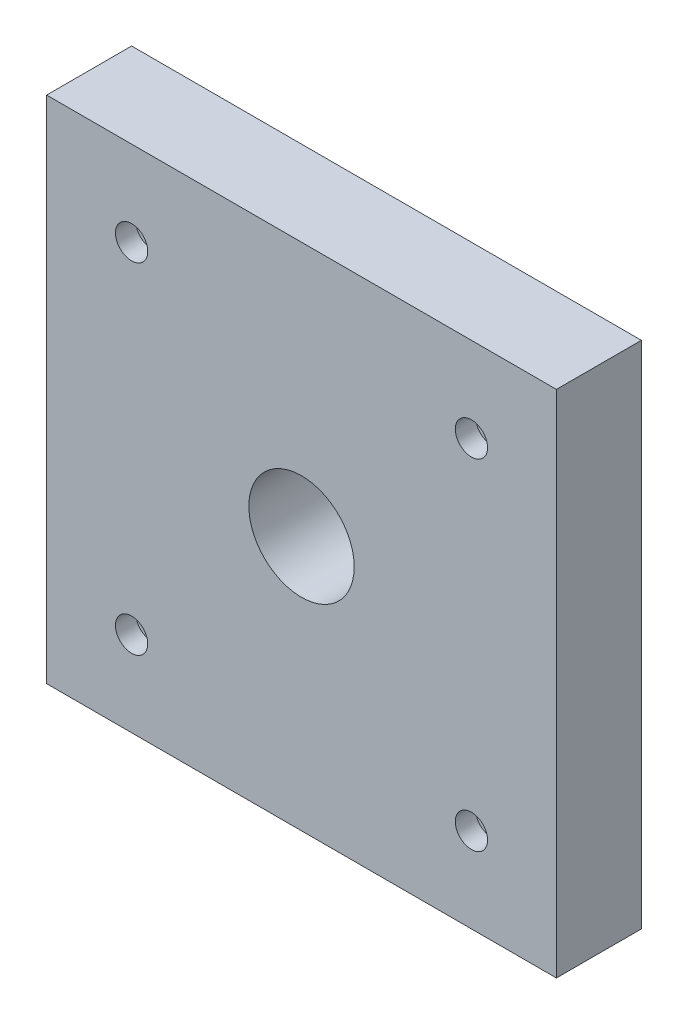
ISO-10303-21;
HEADER;
FILE_DESCRIPTION(('STEP AP214'),'2;1');
FILE_NAME('part.step','',(''),(''),'','','');
FILE_SCHEMA(('AUTOMOTIVE_DESIGN { 1 0 10303 214 1 1 1 1 }'));
ENDSEC;
DATA;
#1=APPLICATION_CONTEXT('core data for automotive mechanical design processes');
#2=APPLICATION_PROTOCOL_DEFINITION('international standard','automotive_design',2000,#1);
#3=PRODUCT_CONTEXT('',#1,'mechanical');
#4=PRODUCT('Part','Part','',(#3));
#5=PRODUCT_RELATED_PRODUCT_CATEGORY('part','',(#4));
#6=PRODUCT_DEFINITION_FORMATION('','',#4);
#7=PRODUCT_DEFINITION_CONTEXT('part definition',#1,'design');
#8=PRODUCT_DEFINITION('design','',#6,#7);
#9=PRODUCT_DEFINITION_SHAPE('','',#8);
#10=(LENGTH_UNIT() NAMED_UNIT(*) SI_UNIT(.MILLI.,.METRE.));
#11=(NAMED_UNIT(*) PLANE_ANGLE_UNIT() SI_UNIT($,.RADIAN.));
#12=(NAMED_UNIT(*) SI_UNIT($,.STERADIAN.) SOLID_ANGLE_UNIT());
#13=UNCERTAINTY_MEASURE_WITH_UNIT(LENGTH_MEASURE(1.E-05),#10,'distance_accuracy_value','');
#14=(GEOMETRIC_REPRESENTATION_CONTEXT(3) GLOBAL_UNCERTAINTY_ASSIGNED_CONTEXT((#13)) GLOBAL_UNIT_ASSIGNED_CONTEXT((#10,
#11,#12)) REPRESENTATION_CONTEXT('',''));
#15=CARTESIAN_POINT('',(0.,0.,0.));
#16=DIRECTION('',(0.,0.,1.));
#17=DIRECTION('',(1.,0.,0.));
#18=AXIS2_PLACEMENT_3D('',#15,#16,#17);
#19=CARTESIAN_POINT('',(0.,0.,12.7));
#20=DIRECTION('',(0.,0.,-1.));
#21=DIRECTION('',(-1.,0.,0.));
#22=AXIS2_PLACEMENT_3D('',#19,#20,#21);
#23=PLANE('',#22);
#24=CARTESIAN_POINT('',(-25.3999999999986,-25.4,12.7));
#25=DIRECTION('',(0.,0.,1.));
#26=DIRECTION('',(1.,0.,0.));
#27=AXIS2_PLACEMENT_3D('',#24,#25,#26);
#28=CIRCLE('',#27,2.41300000000073);
#29=CARTESIAN_POINT('',(-22.9869999999979,-25.4,12.7));
#30=VERTEX_POINT('',#29);
#31=EDGE_CURVE('E124',#30,#30,#28,.T.);
#32=ORIENTED_EDGE('',*,*,#31,.F.);
#33=EDGE_LOOP('',(#32));
#34=FACE_BOUND('',#33,.T.);
#35=CARTESIAN_POINT('',(25.4000000000014,-25.3999999999986,12.7));
#36=DIRECTION('',(0.,0.,1.));
#37=DIRECTION('',(1.,0.,0.));
#38=AXIS2_PLACEMENT_3D('',#35,#36,#37);
#39=CIRCLE('',#38,2.41300000000198);
#40=CARTESIAN_POINT('',(27.8130000000034,-25.3999999999986,12.7));
#41=VERTEX_POINT('',#40);
#42=EDGE_CURVE('E131',#41,#41,#39,.T.);
#43=ORIENTED_EDGE('',*,*,#42,.F.);
#44=EDGE_LOOP('',(#43));
#45=FACE_BOUND('',#44,.T.);
#46=CARTESIAN_POINT('',(25.4,25.4000000000014,12.7));
#47=DIRECTION('',(0.,0.,1.));
#48=DIRECTION('',(1.,0.,0.));
#49=AXIS2_PLACEMENT_3D('',#46,#47,#48);
#50=CIRCLE('',#49,2.41300000000147);
#51=CARTESIAN_POINT('',(27.8130000000014,25.4000000000014,12.7));
#52=VERTEX_POINT('',#51);
#53=EDGE_CURVE('E137',#52,#52,#50,.T.);
#54=ORIENTED_EDGE('',*,*,#53,.F.);
#55=EDGE_LOOP('',(#54));
#56=FACE_BOUND('',#55,.T.);
#57=CARTESIAN_POINT('',(-25.4,25.4,12.7));
#58=DIRECTION('',(0.,0.,1.));
#59=DIRECTION('',(1.,0.,0.));
#60=AXIS2_PLACEMENT_3D('',#57,#58,#59);
#61=CIRCLE('',#60,2.413);
#62=CARTESIAN_POINT('',(-22.987,25.4,12.7));
#63=VERTEX_POINT('',#62);
#64=EDGE_CURVE('E118',#63,#63,#61,.T.);
#65=ORIENTED_EDGE('',*,*,#64,.F.);
#66=EDGE_LOOP('',(#65));
#67=FACE_BOUND('',#66,.T.);
#68=DIRECTION('',(0.,1.,0.));
#69=VECTOR('',#68,1.);
#70=CARTESIAN_POINT('',(38.1,-38.1,12.7));
#71=LINE('',#70,#69);
#72=CARTESIAN_POINT('',(38.1,-38.1,12.7));
#73=VERTEX_POINT('',#72);
#74=CARTESIAN_POINT('',(38.1,38.1,12.7));
#75=VERTEX_POINT('',#74);
#76=EDGE_CURVE('E85',#73,#75,#71,.T.);
#77=ORIENTED_EDGE('',*,*,#76,.T.);
#78=DIRECTION('',(-1.,0.,0.));
#79=VECTOR('',#78,1.);
#80=CARTESIAN_POINT('',(-38.1,38.1,12.7));
#81=LINE('',#80,#79);
#82=CARTESIAN_POINT('',(-38.1,38.1,12.7));
#83=VERTEX_POINT('',#82);
#84=EDGE_CURVE('E80',#75,#83,#81,.T.);
#85=ORIENTED_EDGE('',*,*,#84,.T.);
#86=DIRECTION('',(0.,-1.,0.));
#87=VECTOR('',#86,1.);
#88=CARTESIAN_POINT('',(-38.1,-38.1,12.7));
#89=LINE('',#88,#87);
#90=CARTESIAN_POINT('',(-38.1,-38.1,12.7));
#91=VERTEX_POINT('',#90);
#92=EDGE_CURVE('E83',#83,#91,#89,.T.);
#93=ORIENTED_EDGE('',*,*,#92,.T.);
#94=DIRECTION('',(1.,0.,0.));
#95=VECTOR('',#94,1.);
#96=CARTESIAN_POINT('',(-38.1,-38.1,12.7));
#97=LINE('',#96,#95);
#98=EDGE_CURVE('E50',#91,#73,#97,.T.);
#99=ORIENTED_EDGE('',*,*,#98,.T.);
#100=EDGE_LOOP('',(#77,#85,#93,#99));
#101=FACE_BOUND('',#100,.T.);
#102=CARTESIAN_POINT('',(0.,0.,12.7));
#103=DIRECTION('',(0.,0.,1.));
#104=DIRECTION('',(1.,0.,0.));
#105=AXIS2_PLACEMENT_3D('',#102,#103,#104);
#106=CIRCLE('',#105,7.874);
#107=CARTESIAN_POINT('',(7.87399999999999,0.,12.7));
#108=VERTEX_POINT('',#107);
#109=EDGE_CURVE('E100',#108,#108,#106,.T.);
#110=ORIENTED_EDGE('',*,*,#109,.F.);
#111=EDGE_LOOP('',(#110));
#112=FACE_BOUND('',#111,.T.);
#113=ADVANCED_FACE('F33',(#34,#45,#56,#67,#101,#112),#23,.F.);
#114=CARTESIAN_POINT('',(0.,0.,0.));
#115=DIRECTION('',(0.,0.,-1.));
#116=DIRECTION('',(-1.,0.,0.));
#117=AXIS2_PLACEMENT_3D('',#114,#115,#116);
#118=PLANE('',#117);
#119=CARTESIAN_POINT('',(-25.3999999999986,-25.4,0.));
#120=DIRECTION('',(0.,0.,1.));
#121=DIRECTION('',(1.,0.,0.));
#122=AXIS2_PLACEMENT_3D('',#119,#120,#121);
#123=CIRCLE('',#122,1.52400000000073);
#124=CARTESIAN_POINT('',(-23.8759999999979,-25.4,0.));
#125=VERTEX_POINT('',#124);
#126=EDGE_CURVE('E151',#125,#125,#123,.T.);
#127=ORIENTED_EDGE('',*,*,#126,.T.);
#128=EDGE_LOOP('',(#127));
#129=FACE_BOUND('',#128,.T.);
#130=CARTESIAN_POINT('',(25.4000000000014,-25.3999999999986,0.));
#131=DIRECTION('',(0.,0.,1.));
#132=DIRECTION('',(1.,0.,0.));
#133=AXIS2_PLACEMENT_3D('',#130,#131,#132);
#134=CIRCLE('',#133,1.52400000000199);
#135=CARTESIAN_POINT('',(26.9240000000034,-25.3999999999986,0.));
#136=VERTEX_POINT('',#135);
#137=EDGE_CURVE('E157',#136,#136,#134,.T.);
#138=ORIENTED_EDGE('',*,*,#137,.T.);
#139=EDGE_LOOP('',(#138));
#140=FACE_BOUND('',#139,.T.);
#141=CARTESIAN_POINT('',(25.4,25.4000000000014,0.));
#142=DIRECTION('',(0.,0.,1.));
#143=DIRECTION('',(1.,0.,0.));
#144=AXIS2_PLACEMENT_3D('',#141,#142,#143);
#145=CIRCLE('',#144,1.52400000000148);
#146=CARTESIAN_POINT('',(26.9240000000014,25.4000000000014,0.));
#147=VERTEX_POINT('',#146);
#148=EDGE_CURVE('E145',#147,#147,#145,.T.);
#149=ORIENTED_EDGE('',*,*,#148,.T.);
#150=EDGE_LOOP('',(#149));
#151=FACE_BOUND('',#150,.T.);
#152=CARTESIAN_POINT('',(-25.4,25.4,0.));
#153=DIRECTION('',(0.,0.,1.));
#154=DIRECTION('',(1.,0.,0.));
#155=AXIS2_PLACEMENT_3D('',#152,#153,#154);
#156=CIRCLE('',#155,1.524);
#157=CARTESIAN_POINT('',(-23.876,25.4,0.));
#158=VERTEX_POINT('',#157);
#159=EDGE_CURVE('E128',#158,#158,#156,.T.);
#160=ORIENTED_EDGE('',*,*,#159,.T.);
#161=EDGE_LOOP('',(#160));
#162=FACE_BOUND('',#161,.T.);
#163=DIRECTION('',(0.,1.,0.));
#164=VECTOR('',#163,1.);
#165=CARTESIAN_POINT('',(38.1,-38.1,0.));
#166=LINE('',#165,#164);
#167=CARTESIAN_POINT('',(38.1,-38.1,0.));
#168=VERTEX_POINT('',#167);
#169=CARTESIAN_POINT('',(38.1,38.1,0.));
#170=VERTEX_POINT('',#169);
#171=EDGE_CURVE('E97',#168,#170,#166,.T.);
#172=ORIENTED_EDGE('',*,*,#171,.F.);
#173=DIRECTION('',(1.,0.,0.));
#174=VECTOR('',#173,1.);
#175=CARTESIAN_POINT('',(-38.1,-38.1,0.));
#176=LINE('',#175,#174);
#177=CARTESIAN_POINT('',(-38.1,-38.1,0.));
#178=VERTEX_POINT('',#177);
#179=EDGE_CURVE('E73',#178,#168,#176,.T.);
#180=ORIENTED_EDGE('',*,*,#179,.F.);
#181=DIRECTION('',(0.,-1.,0.));
#182=VECTOR('',#181,1.);
#183=CARTESIAN_POINT('',(-38.1,-38.1,0.));
#184=LINE('',#183,#182);
#185=CARTESIAN_POINT('',(-38.1,38.1,0.));
#186=VERTEX_POINT('',#185);
#187=EDGE_CURVE('E67',#186,#178,#184,.T.);
#188=ORIENTED_EDGE('',*,*,#187,.F.);
#189=DIRECTION('',(-1.,0.,0.));
#190=VECTOR('',#189,1.);
#191=CARTESIAN_POINT('',(-38.1,38.1,0.));
#192=LINE('',#191,#190);
#193=EDGE_CURVE('E89',#170,#186,#192,.T.);
#194=ORIENTED_EDGE('',*,*,#193,.F.);
#195=EDGE_LOOP('',(#172,#180,#188,#194));
#196=FACE_BOUND('',#195,.T.);
#197=CARTESIAN_POINT('',(0.,0.,0.));
#198=DIRECTION('',(0.,0.,1.));
#199=DIRECTION('',(1.,0.,0.));
#200=AXIS2_PLACEMENT_3D('',#197,#198,#199);
#201=CIRCLE('',#200,7.874);
#202=CARTESIAN_POINT('',(7.87399999999999,0.,0.));
#203=VERTEX_POINT('',#202);
#204=EDGE_CURVE('E112',#203,#203,#201,.T.);
#205=ORIENTED_EDGE('',*,*,#204,.T.);
#206=EDGE_LOOP('',(#205));
#207=FACE_BOUND('',#206,.T.);
#208=ADVANCED_FACE('F108',(#129,#140,#151,#162,#196,#207),#118,.T.);
#209=CARTESIAN_POINT('',(38.1,-38.1,12.7));
#210=DIRECTION('',(-1.,0.,0.));
#211=DIRECTION('',(0.,0.,1.));
#212=AXIS2_PLACEMENT_3D('',#209,#210,#211);
#213=PLANE('',#212);
#214=ORIENTED_EDGE('',*,*,#171,.T.);
#215=DIRECTION('',(0.,0.,-1.));
#216=VECTOR('',#215,1.);
#217=CARTESIAN_POINT('',(38.1,38.1,12.7));
#218=LINE('',#217,#216);
#219=EDGE_CURVE('E11',#75,#170,#218,.T.);
#220=ORIENTED_EDGE('',*,*,#219,.F.);
#221=ORIENTED_EDGE('',*,*,#76,.F.);
#222=DIRECTION('',(0.,0.,-1.));
#223=VECTOR('',#222,1.);
#224=CARTESIAN_POINT('',(38.1,-38.1,12.7));
#225=LINE('',#224,#223);
#226=EDGE_CURVE('E93',#73,#168,#225,.T.);
#227=ORIENTED_EDGE('',*,*,#226,.T.);
#228=EDGE_LOOP('',(#214,#220,#221,#227));
#229=FACE_BOUND('',#228,.T.);
#230=ADVANCED_FACE('F35',(#229),#213,.F.);
#231=CARTESIAN_POINT('',(-38.1,38.1,12.7));
#232=DIRECTION('',(0.,-1.,0.));
#233=DIRECTION('',(0.,0.,-1.));
#234=AXIS2_PLACEMENT_3D('',#231,#232,#233);
#235=PLANE('',#234);
#236=ORIENTED_EDGE('',*,*,#193,.T.);
#237=DIRECTION('',(0.,0.,-1.));
#238=VECTOR('',#237,1.);
#239=CARTESIAN_POINT('',(-38.1,38.1,12.7));
#240=LINE('',#239,#238);
#241=EDGE_CURVE('E42',#83,#186,#240,.T.);
#242=ORIENTED_EDGE('',*,*,#241,.F.);
#243=ORIENTED_EDGE('',*,*,#84,.F.);
#244=ORIENTED_EDGE('',*,*,#219,.T.);
#245=EDGE_LOOP('',(#236,#242,#243,#244));
#246=FACE_BOUND('',#245,.T.);
#247=ADVANCED_FACE('F88',(#246),#235,.F.);
#248=CARTESIAN_POINT('',(-38.1,-38.1,12.7));
#249=DIRECTION('',(1.,0.,0.));
#250=DIRECTION('',(0.,0.,-1.));
#251=AXIS2_PLACEMENT_3D('',#248,#249,#250);
#252=PLANE('',#251);
#253=ORIENTED_EDGE('',*,*,#187,.T.);
#254=DIRECTION('',(0.,0.,-1.));
#255=VECTOR('',#254,1.);
#256=CARTESIAN_POINT('',(-38.1,-38.1,12.7));
#257=LINE('',#256,#255);
#258=EDGE_CURVE('E90',#91,#178,#257,.T.);
#259=ORIENTED_EDGE('',*,*,#258,.F.);
#260=ORIENTED_EDGE('',*,*,#92,.F.);
#261=ORIENTED_EDGE('',*,*,#241,.T.);
#262=EDGE_LOOP('',(#253,#259,#260,#261));
#263=FACE_BOUND('',#262,.T.);
#264=ADVANCED_FACE('F91',(#263),#252,.F.);
#265=CARTESIAN_POINT('',(-38.1,-38.1,12.7));
#266=DIRECTION('',(0.,1.,0.));
#267=DIRECTION('',(0.,0.,1.));
#268=AXIS2_PLACEMENT_3D('',#265,#266,#267);
#269=PLANE('',#268);
#270=ORIENTED_EDGE('',*,*,#179,.T.);
#271=ORIENTED_EDGE('',*,*,#226,.F.);
#272=ORIENTED_EDGE('',*,*,#98,.F.);
#273=ORIENTED_EDGE('',*,*,#258,.T.);
#274=EDGE_LOOP('',(#270,#271,#272,#273));
#275=FACE_BOUND('',#274,.T.);
#276=ADVANCED_FACE('F105',(#275),#269,.F.);
#277=CARTESIAN_POINT('',(0.,0.,12.7));
#278=DIRECTION('',(0.,0.,-1.));
#279=DIRECTION('',(-1.,0.,0.));
#280=AXIS2_PLACEMENT_3D('',#277,#278,#279);
#281=CYLINDRICAL_SURFACE('',#280,7.874);
#282=ORIENTED_EDGE('',*,*,#109,.T.);
#283=EDGE_LOOP('',(#282));
#284=FACE_BOUND('',#283,.T.);
#285=ORIENTED_EDGE('',*,*,#204,.F.);
#286=EDGE_LOOP('',(#285));
#287=FACE_BOUND('',#286,.T.);
#288=ADVANCED_FACE('F198',(#284,#287),#281,.F.);
#289=CARTESIAN_POINT('',(-25.4,25.4,9.652));
#290=DIRECTION('',(0.,0.,1.));
#291=DIRECTION('',(1.,0.,0.));
#292=AXIS2_PLACEMENT_3D('',#289,#290,#291);
#293=CYLINDRICAL_SURFACE('',#292,2.413);
#294=CARTESIAN_POINT('',(-25.4,25.4,9.652));
#295=DIRECTION('',(0.,0.,1.));
#296=DIRECTION('',(1.,0.,0.));
#297=AXIS2_PLACEMENT_3D('',#294,#295,#296);
#298=CIRCLE('',#297,2.413);
#299=CARTESIAN_POINT('',(-22.987,25.4,9.652));
#300=VERTEX_POINT('',#299);
#301=EDGE_CURVE('E115',#300,#300,#298,.T.);
#302=CARTESIAN_POINT('',(-22.987,25.4,9.652));
#303=CARTESIAN_POINT('',(-22.987,25.4,9.68375));
#304=CARTESIAN_POINT('',(-22.987,25.4,9.7155));
#305=CARTESIAN_POINT('',(-22.987,25.4,9.779));
#306=CARTESIAN_POINT('',(-22.987,25.4,9.81075));
#307=CARTESIAN_POINT('',(-22.987,25.4,9.87425));
#308=CARTESIAN_POINT('',(-22.987,25.4,9.906));
#309=CARTESIAN_POINT('',(-22.987,25.4,9.9695));
#310=CARTESIAN_POINT('',(-22.987,25.4,10.00125));
#311=CARTESIAN_POINT('',(-22.987,25.4,10.06475));
#312=CARTESIAN_POINT('',(-22.987,25.4,10.0965));
#313=CARTESIAN_POINT('',(-22.987,25.4,10.16));
#314=CARTESIAN_POINT('',(-22.987,25.4,10.19175));
#315=CARTESIAN_POINT('',(-22.987,25.4,10.25525));
#316=CARTESIAN_POINT('',(-22.987,25.4,10.287));
#317=CARTESIAN_POINT('',(-22.987,25.4,10.3505));
#318=CARTESIAN_POINT('',(-22.987,25.4,10.38225));
#319=CARTESIAN_POINT('',(-22.987,25.4,10.44575));
#320=CARTESIAN_POINT('',(-22.987,25.4,10.4775));
#321=CARTESIAN_POINT('',(-22.987,25.4,10.541));
#322=CARTESIAN_POINT('',(-22.987,25.4,10.57275));
#323=CARTESIAN_POINT('',(-22.987,25.4,10.63625));
#324=CARTESIAN_POINT('',(-22.987,25.4,10.668));
#325=CARTESIAN_POINT('',(-22.987,25.4,10.7315));
#326=CARTESIAN_POINT('',(-22.987,25.4,10.76325));
#327=CARTESIAN_POINT('',(-22.987,25.4,10.82675));
#328=CARTESIAN_POINT('',(-22.987,25.4,10.8585));
#329=CARTESIAN_POINT('',(-22.987,25.4,10.922));
#330=CARTESIAN_POINT('',(-22.987,25.4,10.95375));
#331=CARTESIAN_POINT('',(-22.987,25.4,11.01725));
#332=CARTESIAN_POINT('',(-22.987,25.4,11.049));
#333=CARTESIAN_POINT('',(-22.987,25.4,11.1125));
#334=CARTESIAN_POINT('',(-22.987,25.4,11.14425));
#335=CARTESIAN_POINT('',(-22.987,25.4,11.20775));
#336=CARTESIAN_POINT('',(-22.987,25.4,11.2395));
#337=CARTESIAN_POINT('',(-22.987,25.4,11.303));
#338=CARTESIAN_POINT('',(-22.987,25.4,11.33475));
#339=CARTESIAN_POINT('',(-22.987,25.4,11.39825));
#340=CARTESIAN_POINT('',(-22.987,25.4,11.43));
#341=CARTESIAN_POINT('',(-22.987,25.4,11.4935));
#342=CARTESIAN_POINT('',(-22.987,25.4,11.52525));
#343=CARTESIAN_POINT('',(-22.987,25.4,11.58875));
#344=CARTESIAN_POINT('',(-22.987,25.4,11.6205));
#345=CARTESIAN_POINT('',(-22.987,25.4,11.684));
#346=CARTESIAN_POINT('',(-22.987,25.4,11.71575));
#347=CARTESIAN_POINT('',(-22.987,25.4,11.77925));
#348=CARTESIAN_POINT('',(-22.987,25.4,11.811));
#349=CARTESIAN_POINT('',(-22.987,25.4,11.8745));
#350=CARTESIAN_POINT('',(-22.987,25.4,11.90625));
#351=CARTESIAN_POINT('',(-22.987,25.4,11.96975));
#352=CARTESIAN_POINT('',(-22.987,25.4,12.0015));
#353=CARTESIAN_POINT('',(-22.987,25.4,12.065));
#354=CARTESIAN_POINT('',(-22.987,25.4,12.09675));
#355=CARTESIAN_POINT('',(-22.987,25.4,12.16025));
#356=CARTESIAN_POINT('',(-22.987,25.4,12.192));
#357=CARTESIAN_POINT('',(-22.987,25.4,12.2555));
#358=CARTESIAN_POINT('',(-22.987,25.4,12.28725));
#359=CARTESIAN_POINT('',(-22.987,25.4,12.35075));
#360=CARTESIAN_POINT('',(-22.987,25.4,12.3825));
#361=CARTESIAN_POINT('',(-22.987,25.4,12.446));
#362=CARTESIAN_POINT('',(-22.987,25.4,12.47775));
#363=CARTESIAN_POINT('',(-22.987,25.4,12.54125));
#364=CARTESIAN_POINT('',(-22.987,25.4,12.573));
#365=CARTESIAN_POINT('',(-22.987,25.4,12.6365));
#366=CARTESIAN_POINT('',(-22.987,25.4,12.66825));
#367=CARTESIAN_POINT('',(-22.987,25.4,12.7));
#368=B_SPLINE_CURVE_WITH_KNOTS('',3,(#302,#303,#304,#305,#306,#307,#308,#309,#310,#311,#312,
#313,#314,#315,#316,#317,#318,#319,#320,#321,#322,#323,#324,#325,#326,#327,#328,#329,#330,#331,
#332,#333,#334,#335,#336,#337,#338,#339,#340,#341,#342,#343,#344,#345,#346,#347,#348,#349,#350,
#351,#352,#353,#354,#355,#356,#357,#358,#359,#360,#361,#362,#363,#364,#365,#366,#367),
.UNSPECIFIED.,.F.,.F.,(4,2,2,2,2,2,2,2,2,2,2,2,2,2,2,2,2,2,2,2,2,2,2,2,2,2,2,2,2,2,2,2,4),(0.,
0.0952500000000016,0.190500000000001,0.285750000000001,0.381000000000001,0.476250000000001,
0.571500000000001,0.666750000000001,0.762000000000001,0.85725,0.9525,1.04775,1.143,1.23825,
1.3335,1.42875,1.524,1.61925,1.7145,1.80975,1.905,2.00025,2.0955,2.19075,2.286,2.38125,2.4765,
2.57175,2.667,2.76225,2.8575,2.95275,3.048),.UNSPECIFIED.);
#369=EDGE_CURVE('BSEAM196',#300,#63,#368,.T.);
#370=ORIENTED_EDGE('',*,*,#301,.F.);
#371=ORIENTED_EDGE('',*,*,#64,.T.);
#372=ORIENTED_EDGE('',*,*,#369,.T.);
#373=ORIENTED_EDGE('',*,*,#369,.F.);
#374=EDGE_LOOP('',(#370,#372,#371,#373));
#375=FACE_BOUND('',#374,.T.);
#376=ADVANCED_FACE('F196',(#375),#293,.F.);
#377=CARTESIAN_POINT('',(-25.4,25.4,9.652));
#378=DIRECTION('',(0.,0.,1.));
#379=DIRECTION('',(1.,0.,0.));
#380=AXIS2_PLACEMENT_3D('',#377,#378,#379);
#381=PLANE('',#380);
#382=CARTESIAN_POINT('',(-25.4,25.4,9.652));
#383=DIRECTION('',(0.,0.,1.));
#384=DIRECTION('',(1.,0.,0.));
#385=AXIS2_PLACEMENT_3D('',#382,#383,#384);
#386=CIRCLE('',#385,1.524);
#387=CARTESIAN_POINT('',(-23.876,25.4,9.652));
#388=VERTEX_POINT('',#387);
#389=EDGE_CURVE('E142',#388,#388,#386,.T.);
#390=ORIENTED_EDGE('',*,*,#389,.F.);
#391=EDGE_LOOP('',(#390));
#392=FACE_BOUND('',#391,.T.);
#393=ORIENTED_EDGE('',*,*,#301,.T.);
#394=EDGE_LOOP('',(#393));
#395=FACE_BOUND('',#394,.T.);
#396=ADVANCED_FACE('F186',(#392,#395),#381,.T.);
#397=CARTESIAN_POINT('',(25.4,25.4000000000014,9.652));
#398=DIRECTION('',(0.,0.,1.));
#399=DIRECTION('',(1.,0.,0.));
#400=AXIS2_PLACEMENT_3D('',#397,#398,#399);
#401=CYLINDRICAL_SURFACE('',#400,2.41300000000147);
#402=CARTESIAN_POINT('',(25.4,25.4000000000014,9.652));
#403=DIRECTION('',(0.,0.,1.));
#404=DIRECTION('',(1.,0.,0.));
#405=AXIS2_PLACEMENT_3D('',#402,#403,#404);
#406=CIRCLE('',#405,2.41300000000147);
#407=CARTESIAN_POINT('',(27.8130000000014,25.4000000000014,9.652));
#408=VERTEX_POINT('',#407);
#409=EDGE_CURVE('E121',#408,#408,#406,.T.);
#410=CARTESIAN_POINT('',(27.8130000000014,25.4000000000014,9.652));
#411=CARTESIAN_POINT('',(27.8130000000014,25.4000000000014,9.68375));
#412=CARTESIAN_POINT('',(27.8130000000014,25.4000000000014,9.7155));
#413=CARTESIAN_POINT('',(27.8130000000014,25.4000000000014,9.779));
#414=CARTESIAN_POINT('',(27.8130000000014,25.4000000000014,9.81075));
#415=CARTESIAN_POINT('',(27.8130000000014,25.4000000000014,9.87425));
#416=CARTESIAN_POINT('',(27.8130000000014,25.4000000000014,9.906));
#417=CARTESIAN_POINT('',(27.8130000000014,25.4000000000014,9.9695));
#418=CARTESIAN_POINT('',(27.8130000000014,25.4000000000014,10.00125));
#419=CARTESIAN_POINT('',(27.8130000000014,25.4000000000014,10.06475));
#420=CARTESIAN_POINT('',(27.8130000000014,25.4000000000014,10.0965));
#421=CARTESIAN_POINT('',(27.8130000000014,25.4000000000014,10.16));
#422=CARTESIAN_POINT('',(27.8130000000014,25.4000000000014,10.19175));
#423=CARTESIAN_POINT('',(27.8130000000014,25.4000000000014,10.25525));
#424=CARTESIAN_POINT('',(27.8130000000014,25.4000000000014,10.287));
#425=CARTESIAN_POINT('',(27.8130000000014,25.4000000000014,10.3505));
#426=CARTESIAN_POINT('',(27.8130000000014,25.4000000000014,10.38225));
#427=CARTESIAN_POINT('',(27.8130000000014,25.4000000000014,10.44575));
#428=CARTESIAN_POINT('',(27.8130000000014,25.4000000000014,10.4775));
#429=CARTESIAN_POINT('',(27.8130000000014,25.4000000000014,10.541));
#430=CARTESIAN_POINT('',(27.8130000000014,25.4000000000014,10.57275));
#431=CARTESIAN_POINT('',(27.8130000000014,25.4000000000014,10.63625));
#432=CARTESIAN_POINT('',(27.8130000000014,25.4000000000014,10.668));
#433=CARTESIAN_POINT('',(27.8130000000014,25.4000000000014,10.7315));
#434=CARTESIAN_POINT('',(27.8130000000014,25.4000000000014,10.76325));
#435=CARTESIAN_POINT('',(27.8130000000014,25.4000000000014,10.82675));
#436=CARTESIAN_POINT('',(27.8130000000014,25.4000000000014,10.8585));
#437=CARTESIAN_POINT('',(27.8130000000014,25.4000000000014,10.922));
#438=CARTESIAN_POINT('',(27.8130000000014,25.4000000000014,10.95375));
#439=CARTESIAN_POINT('',(27.8130000000014,25.4000000000014,11.01725));
#440=CARTESIAN_POINT('',(27.8130000000014,25.4000000000014,11.049));
#441=CARTESIAN_POINT('',(27.8130000000014,25.4000000000014,11.1125));
#442=CARTESIAN_POINT('',(27.8130000000014,25.4000000000014,11.14425));
#443=CARTESIAN_POINT('',(27.8130000000014,25.4000000000014,11.20775));
#444=CARTESIAN_POINT('',(27.8130000000014,25.4000000000014,11.2395));
#445=CARTESIAN_POINT('',(27.8130000000014,25.4000000000014,11.303));
#446=CARTESIAN_POINT('',(27.8130000000014,25.4000000000014,11.33475));
#447=CARTESIAN_POINT('',(27.8130000000014,25.4000000000014,11.39825));
#448=CARTESIAN_POINT('',(27.8130000000014,25.4000000000014,11.43));
#449=CARTESIAN_POINT('',(27.8130000000014,25.4000000000014,11.4935));
#450=CARTESIAN_POINT('',(27.8130000000014,25.4000000000014,11.52525));
#451=CARTESIAN_POINT('',(27.8130000000014,25.4000000000014,11.58875));
#452=CARTESIAN_POINT('',(27.8130000000014,25.4000000000014,11.6205));
#453=CARTESIAN_POINT('',(27.8130000000014,25.4000000000014,11.684));
#454=CARTESIAN_POINT('',(27.8130000000014,25.4000000000014,11.71575));
#455=CARTESIAN_POINT('',(27.8130000000014,25.4000000000014,11.77925));
#456=CARTESIAN_POINT('',(27.8130000000014,25.4000000000014,11.811));
#457=CARTESIAN_POINT('',(27.8130000000014,25.4000000000014,11.8745));
#458=CARTESIAN_POINT('',(27.8130000000014,25.4000000000014,11.90625));
#459=CARTESIAN_POINT('',(27.8130000000014,25.4000000000014,11.96975));
#460=CARTESIAN_POINT('',(27.8130000000014,25.4000000000014,12.0015));
#461=CARTESIAN_POINT('',(27.8130000000014,25.4000000000014,12.065));
#462=CARTESIAN_POINT('',(27.8130000000014,25.4000000000014,12.09675));
#463=CARTESIAN_POINT('',(27.8130000000014,25.4000000000014,12.16025));
#464=CARTESIAN_POINT('',(27.8130000000014,25.4000000000014,12.192));
#465=CARTESIAN_POINT('',(27.8130000000014,25.4000000000014,12.2555));
#466=CARTESIAN_POINT('',(27.8130000000014,25.4000000000014,12.28725));
#467=CARTESIAN_POINT('',(27.8130000000014,25.4000000000014,12.35075));
#468=CARTESIAN_POINT('',(27.8130000000014,25.4000000000014,12.3825));
#469=CARTESIAN_POINT('',(27.8130000000014,25.4000000000014,12.446));
#470=CARTESIAN_POINT('',(27.8130000000014,25.4000000000014,12.47775));
#471=CARTESIAN_POINT('',(27.8130000000014,25.4000000000014,12.54125));
#472=CARTESIAN_POINT('',(27.8130000000014,25.4000000000014,12.573));
#473=CARTESIAN_POINT('',(27.8130000000014,25.4000000000014,12.6365));
#474=CARTESIAN_POINT('',(27.8130000000014,25.4000000000014,12.66825));
#475=CARTESIAN_POINT('',(27.8130000000014,25.4000000000014,12.7));
#476=B_SPLINE_CURVE_WITH_KNOTS('',3,(#410,#411,#412,#413,#414,#415,#416,#417,#418,#419,#420,
#421,#422,#423,#424,#425,#426,#427,#428,#429,#430,#431,#432,#433,#434,#435,#436,#437,#438,#439,
#440,#441,#442,#443,#444,#445,#446,#447,#448,#449,#450,#451,#452,#453,#454,#455,#456,#457,#458,
#459,#460,#461,#462,#463,#464,#465,#466,#467,#468,#469,#470,#471,#472,#473,#474,#475),
.UNSPECIFIED.,.F.,.F.,(4,2,2,2,2,2,2,2,2,2,2,2,2,2,2,2,2,2,2,2,2,2,2,2,2,2,2,2,2,2,2,2,4),(0.,
0.0952500000000016,0.190500000000001,0.285750000000001,0.381000000000001,0.476250000000001,
0.571500000000001,0.666750000000001,0.762000000000001,0.85725,0.9525,1.04775,1.143,1.23825,
1.3335,1.42875,1.524,1.61925,1.7145,1.80975,1.905,2.00025,2.0955,2.19075,2.286,2.38125,2.4765,
2.57175,2.667,2.76225,2.8575,2.95275,3.048),.UNSPECIFIED.);
#477=EDGE_CURVE('BSEAM180',#408,#52,#476,.T.);
#478=ORIENTED_EDGE('',*,*,#409,.F.);
#479=ORIENTED_EDGE('',*,*,#53,.T.);
#480=ORIENTED_EDGE('',*,*,#477,.T.);
#481=ORIENTED_EDGE('',*,*,#477,.F.);
#482=EDGE_LOOP('',(#478,#480,#479,#481));
#483=FACE_BOUND('',#482,.T.);
#484=ADVANCED_FACE('F180',(#483),#401,.F.);
#485=CARTESIAN_POINT('',(25.4,25.4000000000014,9.652));
#486=DIRECTION('',(0.,0.,1.));
#487=DIRECTION('',(1.,0.,0.));
#488=AXIS2_PLACEMENT_3D('',#485,#486,#487);
#489=PLANE('',#488);
#490=CARTESIAN_POINT('',(25.4,25.4000000000014,9.652));
#491=DIRECTION('',(0.,0.,1.));
#492=DIRECTION('',(1.,0.,0.));
#493=AXIS2_PLACEMENT_3D('',#490,#491,#492);
#494=CIRCLE('',#493,1.52400000000148);
#495=CARTESIAN_POINT('',(26.9240000000014,25.4000000000014,9.652));
#496=VERTEX_POINT('',#495);
#497=EDGE_CURVE('E160',#496,#496,#494,.T.);
#498=ORIENTED_EDGE('',*,*,#497,.F.);
#499=EDGE_LOOP('',(#498));
#500=FACE_BOUND('',#499,.T.);
#501=ORIENTED_EDGE('',*,*,#409,.T.);
#502=EDGE_LOOP('',(#501));
#503=FACE_BOUND('',#502,.T.);
#504=ADVANCED_FACE('F176',(#500,#503),#489,.T.);
#505=CARTESIAN_POINT('',(25.4000000000014,-25.3999999999986,9.652));
#506=DIRECTION('',(0.,0.,1.));
#507=DIRECTION('',(1.,0.,0.));
#508=AXIS2_PLACEMENT_3D('',#505,#506,#507);
#509=CYLINDRICAL_SURFACE('',#508,2.41300000000198);
#510=CARTESIAN_POINT('',(25.4000000000014,-25.3999999999986,9.652));
#511=DIRECTION('',(0.,0.,1.));
#512=DIRECTION('',(1.,0.,0.));
#513=AXIS2_PLACEMENT_3D('',#510,#511,#512);
#514=CIRCLE('',#513,2.41300000000198);
#515=CARTESIAN_POINT('',(27.8130000000034,-25.3999999999986,9.652));
#516=VERTEX_POINT('',#515);
#517=EDGE_CURVE('E134',#516,#516,#514,.T.);
#518=CARTESIAN_POINT('',(27.8130000000034,-25.3999999999986,9.652));
#519=CARTESIAN_POINT('',(27.8130000000034,-25.3999999999986,9.68375));
#520=CARTESIAN_POINT('',(27.8130000000034,-25.3999999999986,9.7155));
#521=CARTESIAN_POINT('',(27.8130000000034,-25.3999999999986,9.779));
#522=CARTESIAN_POINT('',(27.8130000000034,-25.3999999999986,9.81075));
#523=CARTESIAN_POINT('',(27.8130000000034,-25.3999999999986,9.87425));
#524=CARTESIAN_POINT('',(27.8130000000034,-25.3999999999986,9.906));
#525=CARTESIAN_POINT('',(27.8130000000034,-25.3999999999986,9.9695));
#526=CARTESIAN_POINT('',(27.8130000000034,-25.3999999999986,10.00125));
#527=CARTESIAN_POINT('',(27.8130000000034,-25.3999999999986,10.06475));
#528=CARTESIAN_POINT('',(27.8130000000034,-25.3999999999986,10.0965));
#529=CARTESIAN_POINT('',(27.8130000000034,-25.3999999999986,10.16));
#530=CARTESIAN_POINT('',(27.8130000000034,-25.3999999999986,10.19175));
#531=CARTESIAN_POINT('',(27.8130000000034,-25.3999999999986,10.25525));
#532=CARTESIAN_POINT('',(27.8130000000034,-25.3999999999986,10.287));
#533=CARTESIAN_POINT('',(27.8130000000034,-25.3999999999986,10.3505));
#534=CARTESIAN_POINT('',(27.8130000000034,-25.3999999999986,10.38225));
#535=CARTESIAN_POINT('',(27.8130000000034,-25.3999999999986,10.44575));
#536=CARTESIAN_POINT('',(27.8130000000034,-25.3999999999986,10.4775));
#537=CARTESIAN_POINT('',(27.8130000000034,-25.3999999999986,10.541));
#538=CARTESIAN_POINT('',(27.8130000000034,-25.3999999999986,10.57275));
#539=CARTESIAN_POINT('',(27.8130000000034,-25.3999999999986,10.63625));
#540=CARTESIAN_POINT('',(27.8130000000034,-25.3999999999986,10.668));
#541=CARTESIAN_POINT('',(27.8130000000034,-25.3999999999986,10.7315));
#542=CARTESIAN_POINT('',(27.8130000000034,-25.3999999999986,10.76325));
#543=CARTESIAN_POINT('',(27.8130000000034,-25.3999999999986,10.82675));
#544=CARTESIAN_POINT('',(27.8130000000034,-25.3999999999986,10.8585));
#545=CARTESIAN_POINT('',(27.8130000000034,-25.3999999999986,10.922));
#546=CARTESIAN_POINT('',(27.8130000000034,-25.3999999999986,10.95375));
#547=CARTESIAN_POINT('',(27.8130000000034,-25.3999999999986,11.01725));
#548=CARTESIAN_POINT('',(27.8130000000034,-25.3999999999986,11.049));
#549=CARTESIAN_POINT('',(27.8130000000034,-25.3999999999986,11.1125));
#550=CARTESIAN_POINT('',(27.8130000000034,-25.3999999999986,11.14425));
#551=CARTESIAN_POINT('',(27.8130000000034,-25.3999999999986,11.20775));
#552=CARTESIAN_POINT('',(27.8130000000034,-25.3999999999986,11.2395));
#553=CARTESIAN_POINT('',(27.8130000000034,-25.3999999999986,11.303));
#554=CARTESIAN_POINT('',(27.8130000000034,-25.3999999999986,11.33475));
#555=CARTESIAN_POINT('',(27.8130000000034,-25.3999999999986,11.39825));
#556=CARTESIAN_POINT('',(27.8130000000034,-25.3999999999986,11.43));
#557=CARTESIAN_POINT('',(27.8130000000034,-25.3999999999986,11.4935));
#558=CARTESIAN_POINT('',(27.8130000000034,-25.3999999999986,11.52525));
#559=CARTESIAN_POINT('',(27.8130000000034,-25.3999999999986,11.58875));
#560=CARTESIAN_POINT('',(27.8130000000034,-25.3999999999986,11.6205));
#561=CARTESIAN_POINT('',(27.8130000000034,-25.3999999999986,11.684));
#562=CARTESIAN_POINT('',(27.8130000000034,-25.3999999999986,11.71575));
#563=CARTESIAN_POINT('',(27.8130000000034,-25.3999999999986,11.77925));
#564=CARTESIAN_POINT('',(27.8130000000034,-25.3999999999986,11.811));
#565=CARTESIAN_POINT('',(27.8130000000034,-25.3999999999986,11.8745));
#566=CARTESIAN_POINT('',(27.8130000000034,-25.3999999999986,11.90625));
#567=CARTESIAN_POINT('',(27.8130000000034,-25.3999999999986,11.96975));
#568=CARTESIAN_POINT('',(27.8130000000034,-25.3999999999986,12.0015));
#569=CARTESIAN_POINT('',(27.8130000000034,-25.3999999999986,12.065));
#570=CARTESIAN_POINT('',(27.8130000000034,-25.3999999999986,12.09675));
#571=CARTESIAN_POINT('',(27.8130000000034,-25.3999999999986,12.16025));
#572=CARTESIAN_POINT('',(27.8130000000034,-25.3999999999986,12.192));
#573=CARTESIAN_POINT('',(27.8130000000034,-25.3999999999986,12.2555));
#574=CARTESIAN_POINT('',(27.8130000000034,-25.3999999999986,12.28725));
#575=CARTESIAN_POINT('',(27.8130000000034,-25.3999999999986,12.35075));
#576=CARTESIAN_POINT('',(27.8130000000034,-25.3999999999986,12.3825));
#577=CARTESIAN_POINT('',(27.8130000000034,-25.3999999999986,12.446));
#578=CARTESIAN_POINT('',(27.8130000000034,-25.3999999999986,12.47775));
#579=CARTESIAN_POINT('',(27.8130000000034,-25.3999999999986,12.54125));
#580=CARTESIAN_POINT('',(27.8130000000034,-25.3999999999986,12.573));
#581=CARTESIAN_POINT('',(27.8130000000034,-25.3999999999986,12.6365));
#582=CARTESIAN_POINT('',(27.8130000000034,-25.3999999999986,12.66825));
#583=CARTESIAN_POINT('',(27.8130000000034,-25.3999999999986,12.7));
#584=B_SPLINE_CURVE_WITH_KNOTS('',3,(#518,#519,#520,#521,#522,#523,#524,#525,#526,#527,#528,
#529,#530,#531,#532,#533,#534,#535,#536,#537,#538,#539,#540,#541,#542,#543,#544,#545,#546,#547,
#548,#549,#550,#551,#552,#553,#554,#555,#556,#557,#558,#559,#560,#561,#562,#563,#564,#565,#566,
#567,#568,#569,#570,#571,#572,#573,#574,#575,#576,#577,#578,#579,#580,#581,#582,#583),
.UNSPECIFIED.,.F.,.F.,(4,2,2,2,2,2,2,2,2,2,2,2,2,2,2,2,2,2,2,2,2,2,2,2,2,2,2,2,2,2,2,2,4),(0.,
0.0952500000000016,0.190500000000001,0.285750000000001,0.381000000000001,0.476250000000001,
0.571500000000001,0.666750000000001,0.762000000000001,0.85725,0.9525,1.04775,1.143,1.23825,
1.3335,1.42875,1.524,1.61925,1.7145,1.80975,1.905,2.00025,2.0955,2.19075,2.286,2.38125,2.4765,
2.57175,2.667,2.76225,2.8575,2.95275,3.048),.UNSPECIFIED.);
#585=EDGE_CURVE('BSEAM179',#516,#41,#584,.T.);
#586=ORIENTED_EDGE('',*,*,#517,.F.);
#587=ORIENTED_EDGE('',*,*,#42,.T.);
#588=ORIENTED_EDGE('',*,*,#585,.T.);
#589=ORIENTED_EDGE('',*,*,#585,.F.);
#590=EDGE_LOOP('',(#586,#588,#587,#589));
#591=FACE_BOUND('',#590,.T.);
#592=ADVANCED_FACE('F179',(#591),#509,.F.);
#593=CARTESIAN_POINT('',(25.4000000000014,-25.3999999999986,9.652));
#594=DIRECTION('',(0.,0.,1.));
#595=DIRECTION('',(1.,0.,0.));
#596=AXIS2_PLACEMENT_3D('',#593,#594,#595);
#597=PLANE('',#596);
#598=CARTESIAN_POINT('',(25.4000000000014,-25.3999999999986,9.652));
#599=DIRECTION('',(0.,0.,1.));
#600=DIRECTION('',(1.,0.,0.));
#601=AXIS2_PLACEMENT_3D('',#598,#599,#600);
#602=CIRCLE('',#601,1.52400000000199);
#603=CARTESIAN_POINT('',(26.9240000000034,-25.3999999999986,9.652));
#604=VERTEX_POINT('',#603);
#605=EDGE_CURVE('E154',#604,#604,#602,.T.);
#606=ORIENTED_EDGE('',*,*,#605,.F.);
#607=EDGE_LOOP('',(#606));
#608=FACE_BOUND('',#607,.T.);
#609=ORIENTED_EDGE('',*,*,#517,.T.);
#610=EDGE_LOOP('',(#609));
#611=FACE_BOUND('',#610,.T.);
#612=ADVANCED_FACE('F258',(#608,#611),#597,.T.);
#613=CARTESIAN_POINT('',(-25.3999999999986,-25.4,9.652));
#614=DIRECTION('',(0.,0.,1.));
#615=DIRECTION('',(1.,0.,0.));
#616=AXIS2_PLACEMENT_3D('',#613,#614,#615);
#617=CYLINDRICAL_SURFACE('',#616,2.41300000000073);
#618=CARTESIAN_POINT('',(-25.3999999999986,-25.4,9.652));
#619=DIRECTION('',(0.,0.,1.));
#620=DIRECTION('',(1.,0.,0.));
#621=AXIS2_PLACEMENT_3D('',#618,#619,#620);
#622=CIRCLE('',#621,2.41300000000073);
#623=CARTESIAN_POINT('',(-22.9869999999979,-25.4,9.652));
#624=VERTEX_POINT('',#623);
#625=EDGE_CURVE('E127',#624,#624,#622,.T.);
#626=CARTESIAN_POINT('',(-22.9869999999979,-25.4,9.652));
#627=CARTESIAN_POINT('',(-22.9869999999979,-25.4,9.68375));
#628=CARTESIAN_POINT('',(-22.9869999999979,-25.4,9.7155));
#629=CARTESIAN_POINT('',(-22.9869999999979,-25.4,9.779));
#630=CARTESIAN_POINT('',(-22.9869999999979,-25.4,9.81075));
#631=CARTESIAN_POINT('',(-22.9869999999979,-25.4,9.87425));
#632=CARTESIAN_POINT('',(-22.9869999999979,-25.4,9.906));
#633=CARTESIAN_POINT('',(-22.9869999999979,-25.4,9.9695));
#634=CARTESIAN_POINT('',(-22.9869999999979,-25.4,10.00125));
#635=CARTESIAN_POINT('',(-22.9869999999979,-25.4,10.06475));
#636=CARTESIAN_POINT('',(-22.9869999999979,-25.4,10.0965));
#637=CARTESIAN_POINT('',(-22.9869999999979,-25.4,10.16));
#638=CARTESIAN_POINT('',(-22.9869999999979,-25.4,10.19175));
#639=CARTESIAN_POINT('',(-22.9869999999979,-25.4,10.25525));
#640=CARTESIAN_POINT('',(-22.9869999999979,-25.4,10.287));
#641=CARTESIAN_POINT('',(-22.9869999999979,-25.4,10.3505));
#642=CARTESIAN_POINT('',(-22.9869999999979,-25.4,10.38225));
#643=CARTESIAN_POINT('',(-22.9869999999979,-25.4,10.44575));
#644=CARTESIAN_POINT('',(-22.9869999999979,-25.4,10.4775));
#645=CARTESIAN_POINT('',(-22.9869999999979,-25.4,10.541));
#646=CARTESIAN_POINT('',(-22.9869999999979,-25.4,10.57275));
#647=CARTESIAN_POINT('',(-22.9869999999979,-25.4,10.63625));
#648=CARTESIAN_POINT('',(-22.9869999999979,-25.4,10.668));
#649=CARTESIAN_POINT('',(-22.9869999999979,-25.4,10.7315));
#650=CARTESIAN_POINT('',(-22.9869999999979,-25.4,10.76325));
#651=CARTESIAN_POINT('',(-22.9869999999979,-25.4,10.82675));
#652=CARTESIAN_POINT('',(-22.9869999999979,-25.4,10.8585));
#653=CARTESIAN_POINT('',(-22.9869999999979,-25.4,10.922));
#654=CARTESIAN_POINT('',(-22.9869999999979,-25.4,10.95375));
#655=CARTESIAN_POINT('',(-22.9869999999979,-25.4,11.01725));
#656=CARTESIAN_POINT('',(-22.9869999999979,-25.4,11.049));
#657=CARTESIAN_POINT('',(-22.9869999999979,-25.4,11.1125));
#658=CARTESIAN_POINT('',(-22.9869999999979,-25.4,11.14425));
#659=CARTESIAN_POINT('',(-22.9869999999979,-25.4,11.20775));
#660=CARTESIAN_POINT('',(-22.9869999999979,-25.4,11.2395));
#661=CARTESIAN_POINT('',(-22.9869999999979,-25.4,11.303));
#662=CARTESIAN_POINT('',(-22.9869999999979,-25.4,11.33475));
#663=CARTESIAN_POINT('',(-22.9869999999979,-25.4,11.39825));
#664=CARTESIAN_POINT('',(-22.9869999999979,-25.4,11.43));
#665=CARTESIAN_POINT('',(-22.9869999999979,-25.4,11.4935));
#666=CARTESIAN_POINT('',(-22.9869999999979,-25.4,11.52525));
#667=CARTESIAN_POINT('',(-22.9869999999979,-25.4,11.58875));
#668=CARTESIAN_POINT('',(-22.9869999999979,-25.4,11.6205));
#669=CARTESIAN_POINT('',(-22.9869999999979,-25.4,11.684));
#670=CARTESIAN_POINT('',(-22.9869999999979,-25.4,11.71575));
#671=CARTESIAN_POINT('',(-22.9869999999979,-25.4,11.77925));
#672=CARTESIAN_POINT('',(-22.9869999999979,-25.4,11.811));
#673=CARTESIAN_POINT('',(-22.9869999999979,-25.4,11.8745));
#674=CARTESIAN_POINT('',(-22.9869999999979,-25.4,11.90625));
#675=CARTESIAN_POINT('',(-22.9869999999979,-25.4,11.96975));
#676=CARTESIAN_POINT('',(-22.9869999999979,-25.4,12.0015));
#677=CARTESIAN_POINT('',(-22.9869999999979,-25.4,12.065));
#678=CARTESIAN_POINT('',(-22.9869999999979,-25.4,12.09675));
#679=CARTESIAN_POINT('',(-22.9869999999979,-25.4,12.16025));
#680=CARTESIAN_POINT('',(-22.9869999999979,-25.4,12.192));
#681=CARTESIAN_POINT('',(-22.9869999999979,-25.4,12.2555));
#682=CARTESIAN_POINT('',(-22.9869999999979,-25.4,12.28725));
#683=CARTESIAN_POINT('',(-22.9869999999979,-25.4,12.35075));
#684=CARTESIAN_POINT('',(-22.9869999999979,-25.4,12.3825));
#685=CARTESIAN_POINT('',(-22.9869999999979,-25.4,12.446));
#686=CARTESIAN_POINT('',(-22.9869999999979,-25.4,12.47775));
#687=CARTESIAN_POINT('',(-22.9869999999979,-25.4,12.54125));
#688=CARTESIAN_POINT('',(-22.9869999999979,-25.4,12.573));
#689=CARTESIAN_POINT('',(-22.9869999999979,-25.4,12.6365));
#690=CARTESIAN_POINT('',(-22.9869999999979,-25.4,12.66825));
#691=CARTESIAN_POINT('',(-22.9869999999979,-25.4,12.7));
#692=B_SPLINE_CURVE_WITH_KNOTS('',3,(#626,#627,#628,#629,#630,#631,#632,#633,#634,#635,#636,
#637,#638,#639,#640,#641,#642,#643,#644,#645,#646,#647,#648,#649,#650,#651,#652,#653,#654,#655,
#656,#657,#658,#659,#660,#661,#662,#663,#664,#665,#666,#667,#668,#669,#670,#671,#672,#673,#674,
#675,#676,#677,#678,#679,#680,#681,#682,#683,#684,#685,#686,#687,#688,#689,#690,#691),
.UNSPECIFIED.,.F.,.F.,(4,2,2,2,2,2,2,2,2,2,2,2,2,2,2,2,2,2,2,2,2,2,2,2,2,2,2,2,2,2,2,2,4),(0.,
0.0952500000000016,0.190500000000001,0.285750000000001,0.381000000000001,0.476250000000001,
0.571500000000001,0.666750000000001,0.762000000000001,0.85725,0.9525,1.04775,1.143,1.23825,
1.3335,1.42875,1.524,1.61925,1.7145,1.80975,1.905,2.00025,2.0955,2.19075,2.286,2.38125,2.4765,
2.57175,2.667,2.76225,2.8575,2.95275,3.048),.UNSPECIFIED.);
#693=EDGE_CURVE('BSEAM266',#624,#30,#692,.T.);
#694=ORIENTED_EDGE('',*,*,#625,.F.);
#695=ORIENTED_EDGE('',*,*,#31,.T.);
#696=ORIENTED_EDGE('',*,*,#693,.T.);
#697=ORIENTED_EDGE('',*,*,#693,.F.);
#698=EDGE_LOOP('',(#694,#696,#695,#697));
#699=FACE_BOUND('',#698,.T.);
#700=ADVANCED_FACE('F266',(#699),#617,.F.);
#701=CARTESIAN_POINT('',(-25.3999999999986,-25.4,9.652));
#702=DIRECTION('',(0.,0.,1.));
#703=DIRECTION('',(1.,0.,0.));
#704=AXIS2_PLACEMENT_3D('',#701,#702,#703);
#705=PLANE('',#704);
#706=CARTESIAN_POINT('',(-25.3999999999986,-25.4,9.652));
#707=DIRECTION('',(0.,0.,1.));
#708=DIRECTION('',(1.,0.,0.));
#709=AXIS2_PLACEMENT_3D('',#706,#707,#708);
#710=CIRCLE('',#709,1.52400000000073);
#711=CARTESIAN_POINT('',(-23.8759999999979,-25.4,9.652));
#712=VERTEX_POINT('',#711);
#713=EDGE_CURVE('E148',#712,#712,#710,.T.);
#714=ORIENTED_EDGE('',*,*,#713,.F.);
#715=EDGE_LOOP('',(#714));
#716=FACE_BOUND('',#715,.T.);
#717=ORIENTED_EDGE('',*,*,#625,.T.);
#718=EDGE_LOOP('',(#717));
#719=FACE_BOUND('',#718,.T.);
#720=ADVANCED_FACE('F270',(#716,#719),#705,.T.);
#721=CARTESIAN_POINT('',(-25.4,25.4,0.));
#722=DIRECTION('',(0.,0.,1.));
#723=DIRECTION('',(1.,0.,0.));
#724=AXIS2_PLACEMENT_3D('',#721,#722,#723);
#725=CYLINDRICAL_SURFACE('',#724,1.524);
#726=ORIENTED_EDGE('',*,*,#159,.F.);
#727=EDGE_LOOP('',(#726));
#728=FACE_BOUND('',#727,.T.);
#729=ORIENTED_EDGE('',*,*,#389,.T.);
#730=EDGE_LOOP('',(#729));
#731=FACE_BOUND('',#730,.T.);
#732=ADVANCED_FACE('F172',(#728,#731),#725,.F.);
#733=CARTESIAN_POINT('',(25.4,25.4000000000014,0.));
#734=DIRECTION('',(0.,0.,1.));
#735=DIRECTION('',(1.,0.,0.));
#736=AXIS2_PLACEMENT_3D('',#733,#734,#735);
#737=CYLINDRICAL_SURFACE('',#736,1.52400000000148);
#738=ORIENTED_EDGE('',*,*,#148,.F.);
#739=EDGE_LOOP('',(#738));
#740=FACE_BOUND('',#739,.T.);
#741=ORIENTED_EDGE('',*,*,#497,.T.);
#742=EDGE_LOOP('',(#741));
#743=FACE_BOUND('',#742,.T.);
#744=ADVANCED_FACE('F168',(#740,#743),#737,.F.);
#745=CARTESIAN_POINT('',(25.4000000000014,-25.3999999999986,0.));
#746=DIRECTION('',(0.,0.,1.));
#747=DIRECTION('',(1.,0.,0.));
#748=AXIS2_PLACEMENT_3D('',#745,#746,#747);
#749=CYLINDRICAL_SURFACE('',#748,1.52400000000199);
#750=ORIENTED_EDGE('',*,*,#137,.F.);
#751=EDGE_LOOP('',(#750));
#752=FACE_BOUND('',#751,.T.);
#753=ORIENTED_EDGE('',*,*,#605,.T.);
#754=EDGE_LOOP('',(#753));
#755=FACE_BOUND('',#754,.T.);
#756=ADVANCED_FACE('F171',(#752,#755),#749,.F.);
#757=CARTESIAN_POINT('',(-25.3999999999986,-25.4,0.));
#758=DIRECTION('',(0.,0.,1.));
#759=DIRECTION('',(1.,0.,0.));
#760=AXIS2_PLACEMENT_3D('',#757,#758,#759);
#761=CYLINDRICAL_SURFACE('',#760,1.52400000000073);
#762=ORIENTED_EDGE('',*,*,#126,.F.);
#763=EDGE_LOOP('',(#762));
#764=FACE_BOUND('',#763,.T.);
#765=ORIENTED_EDGE('',*,*,#713,.T.);
#766=EDGE_LOOP('',(#765));
#767=FACE_BOUND('',#766,.T.);
#768=ADVANCED_FACE('F299',(#764,#767),#761,.F.);
#769=CLOSED_SHELL('',(#113,#208,#230,#247,#264,#276,#288,#376,#396,#484,#504,#592,#612,#700,
#720,#732,#744,#756,#768));
#770=MANIFOLD_SOLID_BREP('B2',#769);
#771=ADVANCED_BREP_SHAPE_REPRESENTATION('',(#18,#770),#14);
#772=SHAPE_DEFINITION_REPRESENTATION(#9,#771);
ENDSEC;
END-ISO-10303-21;
